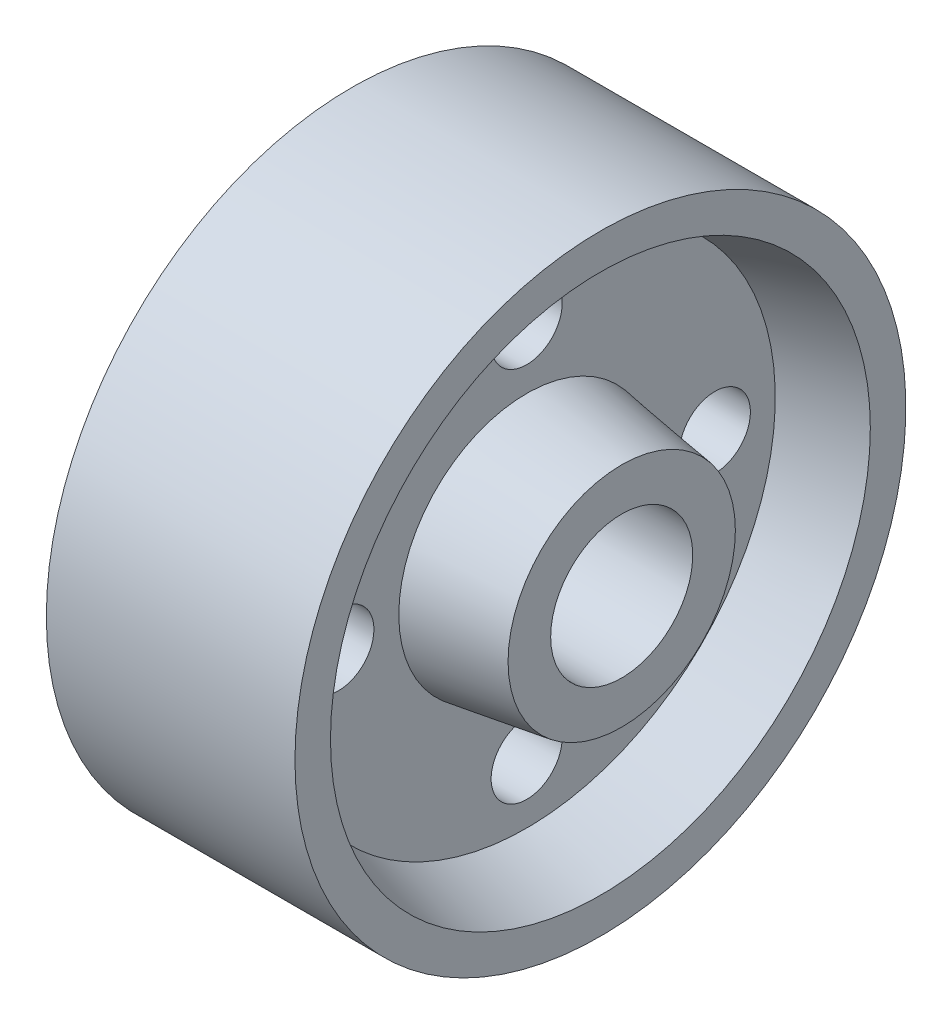
ISO-10303-21;
HEADER;
FILE_DESCRIPTION(('STEP AP214'),'2;1');
FILE_NAME('part.step','',(''),(''),'','','');
FILE_SCHEMA(('AUTOMOTIVE_DESIGN { 1 0 10303 214 1 1 1 1 }'));
ENDSEC;
DATA;
#1=APPLICATION_CONTEXT('core data for automotive mechanical design processes');
#2=APPLICATION_PROTOCOL_DEFINITION('international standard','automotive_design',2000,#1);
#3=PRODUCT_CONTEXT('',#1,'mechanical');
#4=PRODUCT('Part','Part','',(#3));
#5=PRODUCT_RELATED_PRODUCT_CATEGORY('part','',(#4));
#6=PRODUCT_DEFINITION_FORMATION('','',#4);
#7=PRODUCT_DEFINITION_CONTEXT('part definition',#1,'design');
#8=PRODUCT_DEFINITION('design','',#6,#7);
#9=PRODUCT_DEFINITION_SHAPE('','',#8);
#10=(LENGTH_UNIT() NAMED_UNIT(*) SI_UNIT(.MILLI.,.METRE.));
#11=(NAMED_UNIT(*) PLANE_ANGLE_UNIT() SI_UNIT($,.RADIAN.));
#12=(NAMED_UNIT(*) SI_UNIT($,.STERADIAN.) SOLID_ANGLE_UNIT());
#13=UNCERTAINTY_MEASURE_WITH_UNIT(LENGTH_MEASURE(1.E-05),#10,'distance_accuracy_value','');
#14=(GEOMETRIC_REPRESENTATION_CONTEXT(3) GLOBAL_UNCERTAINTY_ASSIGNED_CONTEXT((#13)) GLOBAL_UNIT_ASSIGNED_CONTEXT((#10,
#11,#12)) REPRESENTATION_CONTEXT('',''));
#15=CARTESIAN_POINT('',(0.,0.,0.));
#16=DIRECTION('',(0.,0.,1.));
#17=DIRECTION('',(1.,0.,0.));
#18=AXIS2_PLACEMENT_3D('',#15,#16,#17);
#19=CARTESIAN_POINT('',(67.539059873892,0.,0.));
#20=DIRECTION('',(-1.,0.,0.));
#21=DIRECTION('',(0.,0.,1.));
#22=AXIS2_PLACEMENT_3D('',#19,#20,#21);
#23=CONICAL_SURFACE('',#22,16.,0.148344977787376);
#24=CARTESIAN_POINT('',(54.1560142226062,0.,0.));
#25=DIRECTION('',(-1.,0.,0.));
#26=DIRECTION('',(0.,0.,1.));
#27=AXIS2_PLACEMENT_3D('',#24,#25,#26);
#28=CIRCLE('',#27,18.);
#29=CARTESIAN_POINT('',(54.1560142226062,0.,18.));
#30=VERTEX_POINT('',#29);
#31=EDGE_CURVE('E75',#30,#30,#28,.T.);
#32=ORIENTED_EDGE('',*,*,#31,.F.);
#33=EDGE_LOOP('',(#32));
#34=FACE_BOUND('',#33,.T.);
#35=CARTESIAN_POINT('',(67.539059873892,0.,0.));
#36=DIRECTION('',(-1.,0.,0.));
#37=DIRECTION('',(0.,0.,1.));
#38=AXIS2_PLACEMENT_3D('',#35,#36,#37);
#39=CIRCLE('',#38,16.);
#40=CARTESIAN_POINT('',(67.539059873892,0.,16.));
#41=VERTEX_POINT('',#40);
#42=EDGE_CURVE('E10',#41,#41,#39,.T.);
#43=ORIENTED_EDGE('',*,*,#42,.T.);
#44=EDGE_LOOP('',(#43));
#45=FACE_BOUND('',#44,.T.);
#46=ADVANCED_FACE('F35',(#34,#45),#23,.T.);
#47=CARTESIAN_POINT('',(67.539059873892,10.,0.));
#48=DIRECTION('',(-1.,0.,0.));
#49=DIRECTION('',(0.,0.,1.));
#50=AXIS2_PLACEMENT_3D('',#47,#48,#49);
#51=PLANE('',#50);
#52=ORIENTED_EDGE('',*,*,#42,.F.);
#53=EDGE_LOOP('',(#52));
#54=FACE_BOUND('',#53,.T.);
#55=CARTESIAN_POINT('',(67.539059873892,0.,0.));
#56=DIRECTION('',(-1.,0.,0.));
#57=DIRECTION('',(0.,0.,1.));
#58=AXIS2_PLACEMENT_3D('',#55,#56,#57);
#59=CIRCLE('',#58,10.);
#60=CARTESIAN_POINT('',(67.539059873892,0.,10.));
#61=VERTEX_POINT('',#60);
#62=EDGE_CURVE('E41',#61,#61,#59,.T.);
#63=ORIENTED_EDGE('',*,*,#62,.T.);
#64=EDGE_LOOP('',(#63));
#65=FACE_BOUND('',#64,.T.);
#66=ADVANCED_FACE('F123',(#54,#65),#51,.F.);
#67=CARTESIAN_POINT('',(0.,0.,0.));
#68=DIRECTION('',(-1.,0.,0.));
#69=DIRECTION('',(0.,0.,1.));
#70=AXIS2_PLACEMENT_3D('',#67,#68,#69);
#71=CYLINDRICAL_SURFACE('',#70,10.);
#72=ORIENTED_EDGE('',*,*,#62,.F.);
#73=EDGE_LOOP('',(#72));
#74=FACE_BOUND('',#73,.T.);
#75=CARTESIAN_POINT('',(26.539059873892,0.,0.));
#76=DIRECTION('',(-1.,0.,0.));
#77=DIRECTION('',(0.,0.,1.));
#78=AXIS2_PLACEMENT_3D('',#75,#76,#77);
#79=CIRCLE('',#78,10.);
#80=CARTESIAN_POINT('',(26.539059873892,0.,10.));
#81=VERTEX_POINT('',#80);
#82=EDGE_CURVE('E45',#81,#81,#79,.T.);
#83=ORIENTED_EDGE('',*,*,#82,.T.);
#84=EDGE_LOOP('',(#83));
#85=FACE_BOUND('',#84,.T.);
#86=ADVANCED_FACE('F127',(#74,#85),#71,.F.);
#87=CARTESIAN_POINT('',(26.539059873892,10.,0.));
#88=DIRECTION('',(1.,0.,0.));
#89=DIRECTION('',(0.,0.,-1.));
#90=AXIS2_PLACEMENT_3D('',#87,#88,#89);
#91=PLANE('',#90);
#92=ORIENTED_EDGE('',*,*,#82,.F.);
#93=EDGE_LOOP('',(#92));
#94=FACE_BOUND('',#93,.T.);
#95=CARTESIAN_POINT('',(26.539059873892,0.,0.));
#96=DIRECTION('',(-1.,0.,0.));
#97=DIRECTION('',(0.,0.,1.));
#98=AXIS2_PLACEMENT_3D('',#95,#96,#97);
#99=CIRCLE('',#98,16.);
#100=CARTESIAN_POINT('',(26.539059873892,0.,16.));
#101=VERTEX_POINT('',#100);
#102=EDGE_CURVE('E49',#101,#101,#99,.T.);
#103=ORIENTED_EDGE('',*,*,#102,.T.);
#104=EDGE_LOOP('',(#103));
#105=FACE_BOUND('',#104,.T.);
#106=ADVANCED_FACE('F132',(#94,#105),#91,.F.);
#107=CARTESIAN_POINT('',(39.9221055251778,0.,0.));
#108=DIRECTION('',(1.,0.,0.));
#109=DIRECTION('',(0.,0.,-1.));
#110=AXIS2_PLACEMENT_3D('',#107,#108,#109);
#111=CONICAL_SURFACE('',#110,18.,0.148344977787376);
#112=ORIENTED_EDGE('',*,*,#102,.F.);
#113=EDGE_LOOP('',(#112));
#114=FACE_BOUND('',#113,.T.);
#115=CARTESIAN_POINT('',(39.9221055251778,0.,0.));
#116=DIRECTION('',(-1.,0.,0.));
#117=DIRECTION('',(0.,0.,1.));
#118=AXIS2_PLACEMENT_3D('',#115,#116,#117);
#119=CIRCLE('',#118,18.);
#120=CARTESIAN_POINT('',(39.9221055251778,0.,18.));
#121=VERTEX_POINT('',#120);
#122=EDGE_CURVE('E54',#121,#121,#119,.T.);
#123=ORIENTED_EDGE('',*,*,#122,.T.);
#124=EDGE_LOOP('',(#123));
#125=FACE_BOUND('',#124,.T.);
#126=ADVANCED_FACE('F138',(#114,#125),#111,.T.);
#127=CARTESIAN_POINT('',(39.9221055251778,18.,0.));
#128=DIRECTION('',(1.,0.,0.));
#129=DIRECTION('',(0.,0.,-1.));
#130=AXIS2_PLACEMENT_3D('',#127,#128,#129);
#131=PLANE('',#130);
#132=CARTESIAN_POINT('',(39.9221055251778,26.5,0.));
#133=DIRECTION('',(1.,0.,0.));
#134=DIRECTION('',(0.,0.,-1.));
#135=AXIS2_PLACEMENT_3D('',#132,#133,#134);
#136=CIRCLE('',#135,5.);
#137=CARTESIAN_POINT('',(39.9221055251778,26.5,-5.));
#138=VERTEX_POINT('',#137);
#139=EDGE_CURVE('E78',#138,#138,#136,.T.);
#140=ORIENTED_EDGE('',*,*,#139,.T.);
#141=EDGE_LOOP('',(#140));
#142=FACE_BOUND('',#141,.T.);
#143=CARTESIAN_POINT('',(39.9221055251778,0.,-26.5));
#144=DIRECTION('',(1.,0.,0.));
#145=DIRECTION('',(0.,0.,-1.));
#146=AXIS2_PLACEMENT_3D('',#143,#144,#145);
#147=CIRCLE('',#146,5.);
#148=CARTESIAN_POINT('',(39.9221055251778,0.,-31.5));
#149=VERTEX_POINT('',#148);
#150=EDGE_CURVE('E81',#149,#149,#147,.T.);
#151=ORIENTED_EDGE('',*,*,#150,.T.);
#152=EDGE_LOOP('',(#151));
#153=FACE_BOUND('',#152,.T.);
#154=CARTESIAN_POINT('',(39.9221055251778,-26.5,0.));
#155=DIRECTION('',(1.,0.,0.));
#156=DIRECTION('',(0.,0.,-1.));
#157=AXIS2_PLACEMENT_3D('',#154,#155,#156);
#158=CIRCLE('',#157,5.);
#159=CARTESIAN_POINT('',(39.9221055251778,-26.5,-5.));
#160=VERTEX_POINT('',#159);
#161=EDGE_CURVE('E84',#160,#160,#158,.T.);
#162=ORIENTED_EDGE('',*,*,#161,.T.);
#163=EDGE_LOOP('',(#162));
#164=FACE_BOUND('',#163,.T.);
#165=CARTESIAN_POINT('',(39.9221055251778,0.,26.5));
#166=DIRECTION('',(1.,0.,0.));
#167=DIRECTION('',(0.,0.,-1.));
#168=AXIS2_PLACEMENT_3D('',#165,#166,#167);
#169=CIRCLE('',#168,5.);
#170=CARTESIAN_POINT('',(39.9221055251778,0.,21.5));
#171=VERTEX_POINT('',#170);
#172=EDGE_CURVE('E87',#171,#171,#169,.T.);
#173=ORIENTED_EDGE('',*,*,#172,.T.);
#174=EDGE_LOOP('',(#173));
#175=FACE_BOUND('',#174,.T.);
#176=ORIENTED_EDGE('',*,*,#122,.F.);
#177=EDGE_LOOP('',(#176));
#178=FACE_BOUND('',#177,.T.);
#179=CARTESIAN_POINT('',(39.9221055251778,0.,0.));
#180=DIRECTION('',(-1.,0.,0.));
#181=DIRECTION('',(0.,0.,1.));
#182=AXIS2_PLACEMENT_3D('',#179,#180,#181);
#183=CIRCLE('',#182,35.);
#184=CARTESIAN_POINT('',(39.9221055251778,0.,35.));
#185=VERTEX_POINT('',#184);
#186=EDGE_CURVE('E57',#185,#185,#183,.T.);
#187=ORIENTED_EDGE('',*,*,#186,.T.);
#188=EDGE_LOOP('',(#187));
#189=FACE_BOUND('',#188,.T.);
#190=ADVANCED_FACE('F142',(#142,#153,#164,#175,#178,#189),#131,.F.);
#191=CARTESIAN_POINT('',(29.539059873892,0.,0.));
#192=DIRECTION('',(-1.,0.,0.));
#193=DIRECTION('',(0.,0.,1.));
#194=AXIS2_PLACEMENT_3D('',#191,#192,#193);
#195=CONICAL_SURFACE('',#194,38.,0.281272512150626);
#196=ORIENTED_EDGE('',*,*,#186,.F.);
#197=EDGE_LOOP('',(#196));
#198=FACE_BOUND('',#197,.T.);
#199=CARTESIAN_POINT('',(29.539059873892,0.,0.));
#200=DIRECTION('',(-1.,0.,0.));
#201=DIRECTION('',(0.,0.,1.));
#202=AXIS2_PLACEMENT_3D('',#199,#200,#201);
#203=CIRCLE('',#202,38.);
#204=CARTESIAN_POINT('',(29.539059873892,0.,38.));
#205=VERTEX_POINT('',#204);
#206=EDGE_CURVE('E60',#205,#205,#203,.T.);
#207=ORIENTED_EDGE('',*,*,#206,.T.);
#208=EDGE_LOOP('',(#207));
#209=FACE_BOUND('',#208,.T.);
#210=ADVANCED_FACE('F146',(#198,#209),#195,.F.);
#211=CARTESIAN_POINT('',(29.539059873892,38.,0.));
#212=DIRECTION('',(1.,0.,0.));
#213=DIRECTION('',(0.,0.,-1.));
#214=AXIS2_PLACEMENT_3D('',#211,#212,#213);
#215=PLANE('',#214);
#216=ORIENTED_EDGE('',*,*,#206,.F.);
#217=EDGE_LOOP('',(#216));
#218=FACE_BOUND('',#217,.T.);
#219=CARTESIAN_POINT('',(29.539059873892,0.,0.));
#220=DIRECTION('',(-1.,0.,0.));
#221=DIRECTION('',(0.,0.,1.));
#222=AXIS2_PLACEMENT_3D('',#219,#220,#221);
#223=CIRCLE('',#222,43.);
#224=CARTESIAN_POINT('',(29.539059873892,0.,43.));
#225=VERTEX_POINT('',#224);
#226=EDGE_CURVE('E63',#225,#225,#223,.T.);
#227=ORIENTED_EDGE('',*,*,#226,.T.);
#228=EDGE_LOOP('',(#227));
#229=FACE_BOUND('',#228,.T.);
#230=ADVANCED_FACE('F150',(#218,#229),#215,.F.);
#231=CARTESIAN_POINT('',(0.,0.,0.));
#232=DIRECTION('',(-1.,0.,0.));
#233=DIRECTION('',(0.,0.,1.));
#234=AXIS2_PLACEMENT_3D('',#231,#232,#233);
#235=CYLINDRICAL_SURFACE('',#234,43.);
#236=ORIENTED_EDGE('',*,*,#226,.F.);
#237=EDGE_LOOP('',(#236));
#238=FACE_BOUND('',#237,.T.);
#239=CARTESIAN_POINT('',(64.539059873892,0.,0.));
#240=DIRECTION('',(-1.,0.,0.));
#241=DIRECTION('',(0.,0.,1.));
#242=AXIS2_PLACEMENT_3D('',#239,#240,#241);
#243=CIRCLE('',#242,43.);
#244=CARTESIAN_POINT('',(64.539059873892,0.,43.));
#245=VERTEX_POINT('',#244);
#246=EDGE_CURVE('E66',#245,#245,#243,.T.);
#247=ORIENTED_EDGE('',*,*,#246,.T.);
#248=EDGE_LOOP('',(#247));
#249=FACE_BOUND('',#248,.T.);
#250=ADVANCED_FACE('F154',(#238,#249),#235,.T.);
#251=CARTESIAN_POINT('',(64.539059873892,38.,0.));
#252=DIRECTION('',(-1.,0.,0.));
#253=DIRECTION('',(0.,0.,1.));
#254=AXIS2_PLACEMENT_3D('',#251,#252,#253);
#255=PLANE('',#254);
#256=ORIENTED_EDGE('',*,*,#246,.F.);
#257=EDGE_LOOP('',(#256));
#258=FACE_BOUND('',#257,.T.);
#259=CARTESIAN_POINT('',(64.539059873892,0.,0.));
#260=DIRECTION('',(-1.,0.,0.));
#261=DIRECTION('',(0.,0.,1.));
#262=AXIS2_PLACEMENT_3D('',#259,#260,#261);
#263=CIRCLE('',#262,38.);
#264=CARTESIAN_POINT('',(64.539059873892,0.,38.));
#265=VERTEX_POINT('',#264);
#266=EDGE_CURVE('E69',#265,#265,#263,.T.);
#267=ORIENTED_EDGE('',*,*,#266,.T.);
#268=EDGE_LOOP('',(#267));
#269=FACE_BOUND('',#268,.T.);
#270=ADVANCED_FACE('F158',(#258,#269),#255,.F.);
#271=CARTESIAN_POINT('',(54.1560142226062,0.,0.));
#272=DIRECTION('',(1.,0.,0.));
#273=DIRECTION('',(0.,0.,-1.));
#274=AXIS2_PLACEMENT_3D('',#271,#272,#273);
#275=CONICAL_SURFACE('',#274,35.,0.281272512150626);
#276=ORIENTED_EDGE('',*,*,#266,.F.);
#277=EDGE_LOOP('',(#276));
#278=FACE_BOUND('',#277,.T.);
#279=CARTESIAN_POINT('',(54.1560142226062,0.,0.));
#280=DIRECTION('',(-1.,0.,0.));
#281=DIRECTION('',(0.,0.,1.));
#282=AXIS2_PLACEMENT_3D('',#279,#280,#281);
#283=CIRCLE('',#282,35.);
#284=CARTESIAN_POINT('',(54.1560142226062,0.,35.));
#285=VERTEX_POINT('',#284);
#286=EDGE_CURVE('E72',#285,#285,#283,.T.);
#287=ORIENTED_EDGE('',*,*,#286,.T.);
#288=EDGE_LOOP('',(#287));
#289=FACE_BOUND('',#288,.T.);
#290=ADVANCED_FACE('F110',(#278,#289),#275,.F.);
#291=CARTESIAN_POINT('',(54.1560142226062,18.,0.));
#292=DIRECTION('',(-1.,0.,0.));
#293=DIRECTION('',(0.,0.,1.));
#294=AXIS2_PLACEMENT_3D('',#291,#292,#293);
#295=PLANE('',#294);
#296=CARTESIAN_POINT('',(54.1560142226062,26.5,0.));
#297=DIRECTION('',(1.,0.,0.));
#298=DIRECTION('',(0.,0.,-1.));
#299=AXIS2_PLACEMENT_3D('',#296,#297,#298);
#300=CIRCLE('',#299,5.);
#301=CARTESIAN_POINT('',(54.1560142226062,26.5,-5.));
#302=VERTEX_POINT('',#301);
#303=EDGE_CURVE('E90',#302,#302,#300,.T.);
#304=ORIENTED_EDGE('',*,*,#303,.F.);
#305=EDGE_LOOP('',(#304));
#306=FACE_BOUND('',#305,.T.);
#307=CARTESIAN_POINT('',(54.1560142226062,0.,-26.5));
#308=DIRECTION('',(1.,0.,0.));
#309=DIRECTION('',(0.,0.,-1.));
#310=AXIS2_PLACEMENT_3D('',#307,#308,#309);
#311=CIRCLE('',#310,5.);
#312=CARTESIAN_POINT('',(54.1560142226062,0.,-31.5));
#313=VERTEX_POINT('',#312);
#314=EDGE_CURVE('E97',#313,#313,#311,.T.);
#315=ORIENTED_EDGE('',*,*,#314,.F.);
#316=EDGE_LOOP('',(#315));
#317=FACE_BOUND('',#316,.T.);
#318=CARTESIAN_POINT('',(54.1560142226062,-26.5,0.));
#319=DIRECTION('',(1.,0.,0.));
#320=DIRECTION('',(0.,0.,-1.));
#321=AXIS2_PLACEMENT_3D('',#318,#319,#320);
#322=CIRCLE('',#321,5.);
#323=CARTESIAN_POINT('',(54.1560142226062,-26.5,-5.));
#324=VERTEX_POINT('',#323);
#325=EDGE_CURVE('E94',#324,#324,#322,.T.);
#326=ORIENTED_EDGE('',*,*,#325,.F.);
#327=EDGE_LOOP('',(#326));
#328=FACE_BOUND('',#327,.T.);
#329=CARTESIAN_POINT('',(54.1560142226062,0.,26.5));
#330=DIRECTION('',(1.,0.,0.));
#331=DIRECTION('',(0.,0.,-1.));
#332=AXIS2_PLACEMENT_3D('',#329,#330,#331);
#333=CIRCLE('',#332,5.);
#334=CARTESIAN_POINT('',(54.1560142226062,0.,21.5));
#335=VERTEX_POINT('',#334);
#336=EDGE_CURVE('E91',#335,#335,#333,.T.);
#337=ORIENTED_EDGE('',*,*,#336,.F.);
#338=EDGE_LOOP('',(#337));
#339=FACE_BOUND('',#338,.T.);
#340=ORIENTED_EDGE('',*,*,#286,.F.);
#341=EDGE_LOOP('',(#340));
#342=FACE_BOUND('',#341,.T.);
#343=ORIENTED_EDGE('',*,*,#31,.T.);
#344=EDGE_LOOP('',(#343));
#345=FACE_BOUND('',#344,.T.);
#346=ADVANCED_FACE('F106',(#306,#317,#328,#339,#342,#345),#295,.F.);
#347=CARTESIAN_POINT('',(29.1560142226062,0.,26.5));
#348=DIRECTION('',(1.,0.,0.));
#349=DIRECTION('',(0.,0.,-1.));
#350=AXIS2_PLACEMENT_3D('',#347,#348,#349);
#351=CYLINDRICAL_SURFACE('',#350,5.);
#352=ORIENTED_EDGE('',*,*,#336,.T.);
#353=EDGE_LOOP('',(#352));
#354=FACE_BOUND('',#353,.T.);
#355=ORIENTED_EDGE('',*,*,#172,.F.);
#356=EDGE_LOOP('',(#355));
#357=FACE_BOUND('',#356,.T.);
#358=ADVANCED_FACE('F109',(#354,#357),#351,.F.);
#359=CARTESIAN_POINT('',(29.1560142226062,-26.5,0.));
#360=DIRECTION('',(1.,0.,0.));
#361=DIRECTION('',(0.,0.,-1.));
#362=AXIS2_PLACEMENT_3D('',#359,#360,#361);
#363=CYLINDRICAL_SURFACE('',#362,5.);
#364=ORIENTED_EDGE('',*,*,#325,.T.);
#365=EDGE_LOOP('',(#364));
#366=FACE_BOUND('',#365,.T.);
#367=ORIENTED_EDGE('',*,*,#161,.F.);
#368=EDGE_LOOP('',(#367));
#369=FACE_BOUND('',#368,.T.);
#370=ADVANCED_FACE('F168',(#366,#369),#363,.F.);
#371=CARTESIAN_POINT('',(29.1560142226062,0.,-26.5));
#372=DIRECTION('',(1.,0.,0.));
#373=DIRECTION('',(0.,0.,-1.));
#374=AXIS2_PLACEMENT_3D('',#371,#372,#373);
#375=CYLINDRICAL_SURFACE('',#374,5.);
#376=ORIENTED_EDGE('',*,*,#314,.T.);
#377=EDGE_LOOP('',(#376));
#378=FACE_BOUND('',#377,.T.);
#379=ORIENTED_EDGE('',*,*,#150,.F.);
#380=EDGE_LOOP('',(#379));
#381=FACE_BOUND('',#380,.T.);
#382=ADVANCED_FACE('F172',(#378,#381),#375,.F.);
#383=CARTESIAN_POINT('',(29.1560142226062,26.5,0.));
#384=DIRECTION('',(1.,0.,0.));
#385=DIRECTION('',(0.,0.,-1.));
#386=AXIS2_PLACEMENT_3D('',#383,#384,#385);
#387=CYLINDRICAL_SURFACE('',#386,5.);
#388=ORIENTED_EDGE('',*,*,#303,.T.);
#389=EDGE_LOOP('',(#388));
#390=FACE_BOUND('',#389,.T.);
#391=ORIENTED_EDGE('',*,*,#139,.F.);
#392=EDGE_LOOP('',(#391));
#393=FACE_BOUND('',#392,.T.);
#394=ADVANCED_FACE('F103',(#390,#393),#387,.F.);
#395=CLOSED_SHELL('',(#46,#66,#86,#106,#126,#190,#210,#230,#250,#270,#290,#346,#358,#370,#382,#394));
#396=MANIFOLD_SOLID_BREP('B2',#395);
#397=ADVANCED_BREP_SHAPE_REPRESENTATION('',(#18,#396),#14);
#398=SHAPE_DEFINITION_REPRESENTATION(#9,#397);
ENDSEC;
END-ISO-10303-21;
